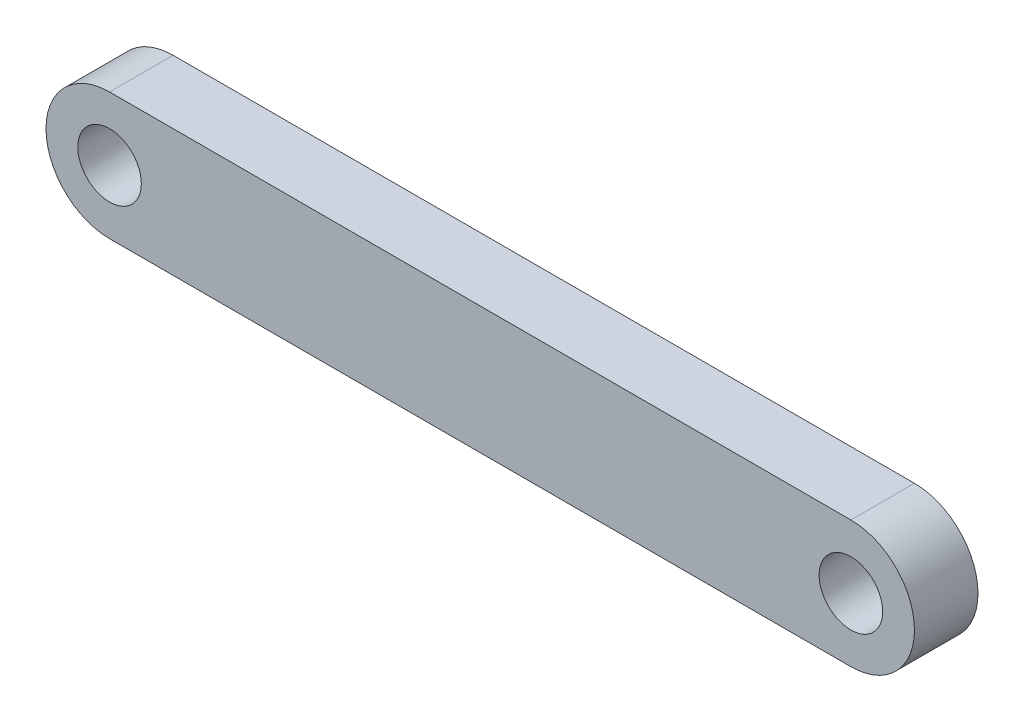
ISO-10303-21;
HEADER;
FILE_DESCRIPTION(('STEP AP214'),'2;1');
FILE_NAME('part.step','',(''),(''),'','','');
FILE_SCHEMA(('AUTOMOTIVE_DESIGN { 1 0 10303 214 1 1 1 1 }'));
ENDSEC;
DATA;
#1=APPLICATION_CONTEXT('core data for automotive mechanical design processes');
#2=APPLICATION_PROTOCOL_DEFINITION('international standard','automotive_design',2000,#1);
#3=PRODUCT_CONTEXT('',#1,'mechanical');
#4=PRODUCT('Part','Part','',(#3));
#5=PRODUCT_RELATED_PRODUCT_CATEGORY('part','',(#4));
#6=PRODUCT_DEFINITION_FORMATION('','',#4);
#7=PRODUCT_DEFINITION_CONTEXT('part definition',#1,'design');
#8=PRODUCT_DEFINITION('design','',#6,#7);
#9=PRODUCT_DEFINITION_SHAPE('','',#8);
#10=(LENGTH_UNIT() NAMED_UNIT(*) SI_UNIT(.MILLI.,.METRE.));
#11=(NAMED_UNIT(*) PLANE_ANGLE_UNIT() SI_UNIT($,.RADIAN.));
#12=(NAMED_UNIT(*) SI_UNIT($,.STERADIAN.) SOLID_ANGLE_UNIT());
#13=UNCERTAINTY_MEASURE_WITH_UNIT(LENGTH_MEASURE(1.E-05),#10,'distance_accuracy_value','');
#14=(GEOMETRIC_REPRESENTATION_CONTEXT(3) GLOBAL_UNCERTAINTY_ASSIGNED_CONTEXT((#13)) GLOBAL_UNIT_ASSIGNED_CONTEXT((#10,
#11,#12)) REPRESENTATION_CONTEXT('',''));
#15=CARTESIAN_POINT('',(0.,0.,0.));
#16=DIRECTION('',(0.,0.,1.));
#17=DIRECTION('',(1.,0.,0.));
#18=AXIS2_PLACEMENT_3D('',#15,#16,#17);
#19=CARTESIAN_POINT('',(0.,0.,3.));
#20=DIRECTION('',(0.,0.,1.));
#21=DIRECTION('',(1.,0.,0.));
#22=AXIS2_PLACEMENT_3D('',#19,#20,#21);
#23=PLANE('',#22);
#24=CARTESIAN_POINT('',(-35.,0.,3.));
#25=DIRECTION('',(0.,0.,1.));
#26=DIRECTION('',(1.,0.,0.));
#27=AXIS2_PLACEMENT_3D('',#24,#25,#26);
#28=CIRCLE('',#27,1.5);
#29=CARTESIAN_POINT('',(-33.5,0.,3.));
#30=VERTEX_POINT('',#29);
#31=EDGE_CURVE('E112',#30,#30,#28,.T.);
#32=ORIENTED_EDGE('',*,*,#31,.F.);
#33=EDGE_LOOP('',(#32));
#34=FACE_BOUND('',#33,.T.);
#35=CARTESIAN_POINT('',(0.,0.,3.));
#36=DIRECTION('',(0.,0.,1.));
#37=DIRECTION('',(1.,0.,0.));
#38=AXIS2_PLACEMENT_3D('',#35,#36,#37);
#39=CIRCLE('',#38,3.);
#40=CARTESIAN_POINT('',(0.,-3.,3.));
#41=VERTEX_POINT('',#40);
#42=CARTESIAN_POINT('',(0.,3.,3.));
#43=VERTEX_POINT('',#42);
#44=EDGE_CURVE('E92',#41,#43,#39,.T.);
#45=ORIENTED_EDGE('',*,*,#44,.T.);
#46=DIRECTION('',(-1.,0.,0.));
#47=VECTOR('',#46,1.);
#48=CARTESIAN_POINT('',(-35.,3.,3.));
#49=LINE('',#48,#47);
#50=CARTESIAN_POINT('',(-35.,3.,3.));
#51=VERTEX_POINT('',#50);
#52=EDGE_CURVE('E87',#43,#51,#49,.T.);
#53=ORIENTED_EDGE('',*,*,#52,.T.);
#54=CARTESIAN_POINT('',(-35.,0.,3.));
#55=DIRECTION('',(0.,0.,1.));
#56=DIRECTION('',(1.,0.,0.));
#57=AXIS2_PLACEMENT_3D('',#54,#55,#56);
#58=CIRCLE('',#57,3.);
#59=CARTESIAN_POINT('',(-35.,-3.,3.));
#60=VERTEX_POINT('',#59);
#61=EDGE_CURVE('E90',#51,#60,#58,.T.);
#62=ORIENTED_EDGE('',*,*,#61,.T.);
#63=DIRECTION('',(1.,0.,0.));
#64=VECTOR('',#63,1.);
#65=CARTESIAN_POINT('',(-35.,-3.,3.));
#66=LINE('',#65,#64);
#67=EDGE_CURVE('E57',#60,#41,#66,.T.);
#68=ORIENTED_EDGE('',*,*,#67,.T.);
#69=EDGE_LOOP('',(#45,#53,#62,#68));
#70=FACE_BOUND('',#69,.T.);
#71=CARTESIAN_POINT('',(0.,0.,3.));
#72=DIRECTION('',(0.,0.,1.));
#73=DIRECTION('',(1.,0.,0.));
#74=AXIS2_PLACEMENT_3D('',#71,#72,#73);
#75=CIRCLE('',#74,1.5);
#76=CARTESIAN_POINT('',(1.5,0.,3.));
#77=VERTEX_POINT('',#76);
#78=EDGE_CURVE('E134',#77,#77,#75,.T.);
#79=ORIENTED_EDGE('',*,*,#78,.F.);
#80=EDGE_LOOP('',(#79));
#81=FACE_BOUND('',#80,.T.);
#82=ADVANCED_FACE('F39',(#34,#70,#81),#23,.T.);
#83=CARTESIAN_POINT('',(0.,0.,0.));
#84=DIRECTION('',(0.,0.,1.));
#85=DIRECTION('',(1.,0.,0.));
#86=AXIS2_PLACEMENT_3D('',#83,#84,#85);
#87=PLANE('',#86);
#88=CARTESIAN_POINT('',(0.,0.,0.));
#89=DIRECTION('',(0.,0.,1.));
#90=DIRECTION('',(1.,0.,0.));
#91=AXIS2_PLACEMENT_3D('',#88,#89,#90);
#92=CIRCLE('',#91,3.);
#93=CARTESIAN_POINT('',(0.,-3.,0.));
#94=VERTEX_POINT('',#93);
#95=CARTESIAN_POINT('',(0.,3.,0.));
#96=VERTEX_POINT('',#95);
#97=EDGE_CURVE('E108',#94,#96,#92,.T.);
#98=ORIENTED_EDGE('',*,*,#97,.F.);
#99=DIRECTION('',(1.,0.,0.));
#100=VECTOR('',#99,1.);
#101=CARTESIAN_POINT('',(-35.,-3.,0.));
#102=LINE('',#101,#100);
#103=CARTESIAN_POINT('',(-35.,-3.,0.));
#104=VERTEX_POINT('',#103);
#105=EDGE_CURVE('E80',#104,#94,#102,.T.);
#106=ORIENTED_EDGE('',*,*,#105,.F.);
#107=CARTESIAN_POINT('',(-35.,0.,0.));
#108=DIRECTION('',(0.,0.,1.));
#109=DIRECTION('',(1.,0.,0.));
#110=AXIS2_PLACEMENT_3D('',#107,#108,#109);
#111=CIRCLE('',#110,3.);
#112=CARTESIAN_POINT('',(-35.,3.,0.));
#113=VERTEX_POINT('',#112);
#114=EDGE_CURVE('E74',#113,#104,#111,.T.);
#115=ORIENTED_EDGE('',*,*,#114,.F.);
#116=DIRECTION('',(-1.,0.,0.));
#117=VECTOR('',#116,1.);
#118=CARTESIAN_POINT('',(-35.,3.,0.));
#119=LINE('',#118,#117);
#120=EDGE_CURVE('E97',#96,#113,#119,.T.);
#121=ORIENTED_EDGE('',*,*,#120,.F.);
#122=EDGE_LOOP('',(#98,#106,#115,#121));
#123=FACE_BOUND('',#122,.T.);
#124=CARTESIAN_POINT('',(-35.,0.,0.));
#125=DIRECTION('',(0.,0.,1.));
#126=DIRECTION('',(1.,0.,0.));
#127=AXIS2_PLACEMENT_3D('',#124,#125,#126);
#128=CIRCLE('',#127,1.5);
#129=CARTESIAN_POINT('',(-33.5,0.,0.));
#130=VERTEX_POINT('',#129);
#131=EDGE_CURVE('E130',#130,#130,#128,.T.);
#132=ORIENTED_EDGE('',*,*,#131,.T.);
#133=EDGE_LOOP('',(#132));
#134=FACE_BOUND('',#133,.T.);
#135=CARTESIAN_POINT('',(0.,0.,0.));
#136=DIRECTION('',(0.,0.,1.));
#137=DIRECTION('',(1.,0.,0.));
#138=AXIS2_PLACEMENT_3D('',#135,#136,#137);
#139=CIRCLE('',#138,1.5);
#140=CARTESIAN_POINT('',(1.5,0.,0.));
#141=VERTEX_POINT('',#140);
#142=EDGE_CURVE('E138',#141,#141,#139,.T.);
#143=ORIENTED_EDGE('',*,*,#142,.T.);
#144=EDGE_LOOP('',(#143));
#145=FACE_BOUND('',#144,.T.);
#146=ADVANCED_FACE('F125',(#123,#134,#145),#87,.F.);
#147=CARTESIAN_POINT('',(0.,0.,3.));
#148=DIRECTION('',(0.,0.,-1.));
#149=DIRECTION('',(-1.,0.,0.));
#150=AXIS2_PLACEMENT_3D('',#147,#148,#149);
#151=CYLINDRICAL_SURFACE('',#150,3.);
#152=ORIENTED_EDGE('',*,*,#97,.T.);
#153=DIRECTION('',(0.,0.,-1.));
#154=VECTOR('',#153,1.);
#155=CARTESIAN_POINT('',(0.,3.,3.));
#156=LINE('',#155,#154);
#157=EDGE_CURVE('E11',#43,#96,#156,.T.);
#158=ORIENTED_EDGE('',*,*,#157,.F.);
#159=ORIENTED_EDGE('',*,*,#44,.F.);
#160=DIRECTION('',(0.,0.,-1.));
#161=VECTOR('',#160,1.);
#162=CARTESIAN_POINT('',(0.,-3.,3.));
#163=LINE('',#162,#161);
#164=EDGE_CURVE('E104',#41,#94,#163,.T.);
#165=ORIENTED_EDGE('',*,*,#164,.T.);
#166=EDGE_LOOP('',(#152,#158,#159,#165));
#167=FACE_BOUND('',#166,.T.);
#168=ADVANCED_FACE('F41',(#167),#151,.T.);
#169=CARTESIAN_POINT('',(-35.,3.,3.));
#170=DIRECTION('',(0.,-1.,0.));
#171=DIRECTION('',(1.,0.,0.));
#172=AXIS2_PLACEMENT_3D('',#169,#170,#171);
#173=PLANE('',#172);
#174=ORIENTED_EDGE('',*,*,#120,.T.);
#175=DIRECTION('',(0.,0.,-1.));
#176=VECTOR('',#175,1.);
#177=CARTESIAN_POINT('',(-35.,3.,3.));
#178=LINE('',#177,#176);
#179=EDGE_CURVE('E49',#51,#113,#178,.T.);
#180=ORIENTED_EDGE('',*,*,#179,.F.);
#181=ORIENTED_EDGE('',*,*,#52,.F.);
#182=ORIENTED_EDGE('',*,*,#157,.T.);
#183=EDGE_LOOP('',(#174,#180,#181,#182));
#184=FACE_BOUND('',#183,.T.);
#185=ADVANCED_FACE('F96',(#184),#173,.F.);
#186=CARTESIAN_POINT('',(-35.,0.,3.));
#187=DIRECTION('',(0.,0.,-1.));
#188=DIRECTION('',(-1.,0.,0.));
#189=AXIS2_PLACEMENT_3D('',#186,#187,#188);
#190=CYLINDRICAL_SURFACE('',#189,3.);
#191=ORIENTED_EDGE('',*,*,#114,.T.);
#192=DIRECTION('',(0.,0.,-1.));
#193=VECTOR('',#192,1.);
#194=CARTESIAN_POINT('',(-35.,-3.,3.));
#195=LINE('',#194,#193);
#196=EDGE_CURVE('E99',#60,#104,#195,.T.);
#197=ORIENTED_EDGE('',*,*,#196,.F.);
#198=ORIENTED_EDGE('',*,*,#61,.F.);
#199=ORIENTED_EDGE('',*,*,#179,.T.);
#200=EDGE_LOOP('',(#191,#197,#198,#199));
#201=FACE_BOUND('',#200,.T.);
#202=ADVANCED_FACE('F100',(#201),#190,.T.);
#203=CARTESIAN_POINT('',(-35.,-3.,3.));
#204=DIRECTION('',(0.,1.,0.));
#205=DIRECTION('',(-1.,0.,0.));
#206=AXIS2_PLACEMENT_3D('',#203,#204,#205);
#207=PLANE('',#206);
#208=ORIENTED_EDGE('',*,*,#105,.T.);
#209=ORIENTED_EDGE('',*,*,#164,.F.);
#210=ORIENTED_EDGE('',*,*,#67,.F.);
#211=ORIENTED_EDGE('',*,*,#196,.T.);
#212=EDGE_LOOP('',(#208,#209,#210,#211));
#213=FACE_BOUND('',#212,.T.);
#214=ADVANCED_FACE('F122',(#213),#207,.F.);
#215=CARTESIAN_POINT('',(-35.,0.,3.));
#216=DIRECTION('',(0.,0.,-1.));
#217=DIRECTION('',(-1.,0.,0.));
#218=AXIS2_PLACEMENT_3D('',#215,#216,#217);
#219=CYLINDRICAL_SURFACE('',#218,1.5);
#220=ORIENTED_EDGE('',*,*,#31,.T.);
#221=EDGE_LOOP('',(#220));
#222=FACE_BOUND('',#221,.T.);
#223=ORIENTED_EDGE('',*,*,#131,.F.);
#224=EDGE_LOOP('',(#223));
#225=FACE_BOUND('',#224,.T.);
#226=ADVANCED_FACE('F157',(#222,#225),#219,.F.);
#227=CARTESIAN_POINT('',(0.,0.,3.));
#228=DIRECTION('',(0.,0.,-1.));
#229=DIRECTION('',(-1.,0.,0.));
#230=AXIS2_PLACEMENT_3D('',#227,#228,#229);
#231=CYLINDRICAL_SURFACE('',#230,1.5);
#232=ORIENTED_EDGE('',*,*,#78,.T.);
#233=EDGE_LOOP('',(#232));
#234=FACE_BOUND('',#233,.T.);
#235=ORIENTED_EDGE('',*,*,#142,.F.);
#236=EDGE_LOOP('',(#235));
#237=FACE_BOUND('',#236,.T.);
#238=ADVANCED_FACE('F146',(#234,#237),#231,.F.);
#239=CLOSED_SHELL('',(#82,#146,#168,#185,#202,#214,#226,#238));
#240=MANIFOLD_SOLID_BREP('B2',#239);
#241=ADVANCED_BREP_SHAPE_REPRESENTATION('',(#18,#240),#14);
#242=SHAPE_DEFINITION_REPRESENTATION(#9,#241);
ENDSEC;
END-ISO-10303-21;
